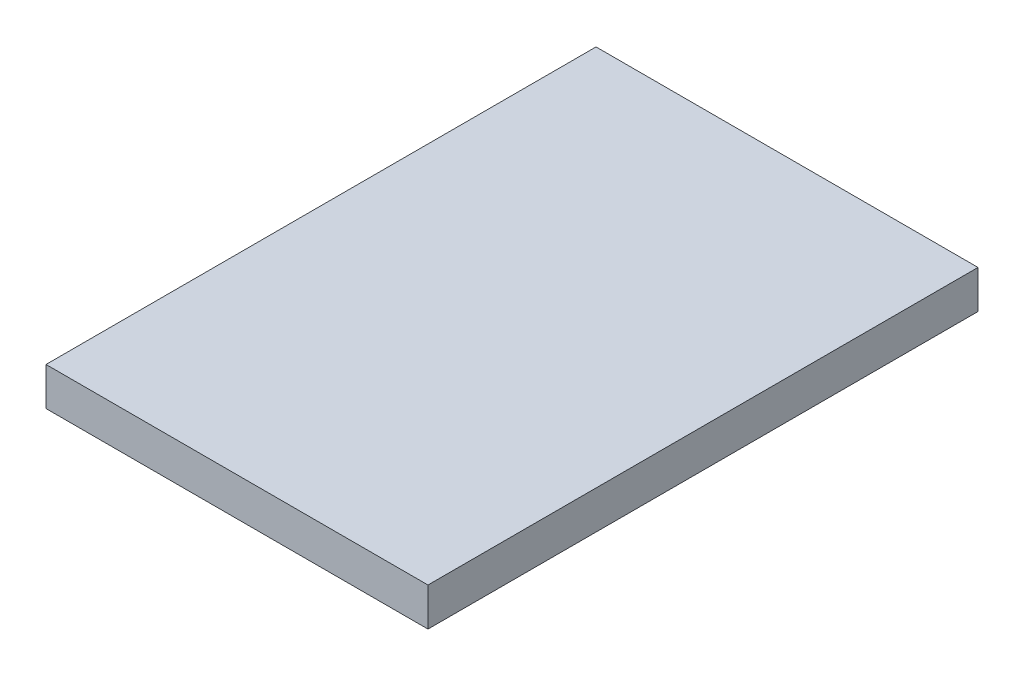
ISO-10303-21;
HEADER;
FILE_DESCRIPTION(('STEP AP214'),'2;1');
FILE_NAME('part.step','',(''),(''),'','','');
FILE_SCHEMA(('AUTOMOTIVE_DESIGN { 1 0 10303 214 1 1 1 1 }'));
ENDSEC;
DATA;
#1=APPLICATION_CONTEXT('core data for automotive mechanical design processes');
#2=APPLICATION_PROTOCOL_DEFINITION('international standard','automotive_design',2000,#1);
#3=PRODUCT_CONTEXT('',#1,'mechanical');
#4=PRODUCT('Part','Part','',(#3));
#5=PRODUCT_RELATED_PRODUCT_CATEGORY('part','',(#4));
#6=PRODUCT_DEFINITION_FORMATION('','',#4);
#7=PRODUCT_DEFINITION_CONTEXT('part definition',#1,'design');
#8=PRODUCT_DEFINITION('design','',#6,#7);
#9=PRODUCT_DEFINITION_SHAPE('','',#8);
#10=(LENGTH_UNIT() NAMED_UNIT(*) SI_UNIT(.MILLI.,.METRE.));
#11=(NAMED_UNIT(*) PLANE_ANGLE_UNIT() SI_UNIT($,.RADIAN.));
#12=(NAMED_UNIT(*) SI_UNIT($,.STERADIAN.) SOLID_ANGLE_UNIT());
#13=UNCERTAINTY_MEASURE_WITH_UNIT(LENGTH_MEASURE(1.E-05),#10,'distance_accuracy_value','');
#14=(GEOMETRIC_REPRESENTATION_CONTEXT(3) GLOBAL_UNCERTAINTY_ASSIGNED_CONTEXT((#13)) GLOBAL_UNIT_ASSIGNED_CONTEXT((#10,
#11,#12)) REPRESENTATION_CONTEXT('',''));
#15=CARTESIAN_POINT('',(0.,0.,0.));
#16=DIRECTION('',(0.,0.,1.));
#17=DIRECTION('',(1.,0.,0.));
#18=AXIS2_PLACEMENT_3D('',#15,#16,#17);
#19=CARTESIAN_POINT('',(12.5,2.5,18.));
#20=DIRECTION('',(-1.,0.,0.));
#21=DIRECTION('',(0.,0.,1.));
#22=AXIS2_PLACEMENT_3D('',#19,#20,#21);
#23=PLANE('',#22);
#24=DIRECTION('',(0.,0.,-1.));
#25=VECTOR('',#24,1.);
#26=CARTESIAN_POINT('',(12.5,0.,18.));
#27=LINE('',#26,#25);
#28=CARTESIAN_POINT('',(12.5,0.,18.));
#29=VERTEX_POINT('',#28);
#30=CARTESIAN_POINT('',(12.5,0.,-18.));
#31=VERTEX_POINT('',#30);
#32=EDGE_CURVE('E96',#29,#31,#27,.T.);
#33=ORIENTED_EDGE('',*,*,#32,.T.);
#34=DIRECTION('',(0.,-1.,0.));
#35=VECTOR('',#34,1.);
#36=CARTESIAN_POINT('',(12.5,2.5,-18.));
#37=LINE('',#36,#35);
#38=CARTESIAN_POINT('',(12.5,2.5,-18.));
#39=VERTEX_POINT('',#38);
#40=EDGE_CURVE('E11',#39,#31,#37,.T.);
#41=ORIENTED_EDGE('',*,*,#40,.F.);
#42=DIRECTION('',(0.,0.,-1.));
#43=VECTOR('',#42,1.);
#44=CARTESIAN_POINT('',(12.5,2.5,18.));
#45=LINE('',#44,#43);
#46=CARTESIAN_POINT('',(12.5,2.5,18.));
#47=VERTEX_POINT('',#46);
#48=EDGE_CURVE('E84',#47,#39,#45,.T.);
#49=ORIENTED_EDGE('',*,*,#48,.F.);
#50=DIRECTION('',(0.,-1.,0.));
#51=VECTOR('',#50,1.);
#52=CARTESIAN_POINT('',(12.5,2.5,18.));
#53=LINE('',#52,#51);
#54=EDGE_CURVE('E92',#47,#29,#53,.T.);
#55=ORIENTED_EDGE('',*,*,#54,.T.);
#56=EDGE_LOOP('',(#33,#41,#49,#55));
#57=FACE_BOUND('',#56,.T.);
#58=ADVANCED_FACE('F33',(#57),#23,.F.);
#59=CARTESIAN_POINT('',(-12.5,2.5,-18.));
#60=DIRECTION('',(0.,0.,1.));
#61=DIRECTION('',(1.,0.,0.));
#62=AXIS2_PLACEMENT_3D('',#59,#60,#61);
#63=PLANE('',#62);
#64=DIRECTION('',(-1.,0.,0.));
#65=VECTOR('',#64,1.);
#66=CARTESIAN_POINT('',(-12.5,0.,-18.));
#67=LINE('',#66,#65);
#68=CARTESIAN_POINT('',(-12.5,0.,-18.));
#69=VERTEX_POINT('',#68);
#70=EDGE_CURVE('E88',#31,#69,#67,.T.);
#71=ORIENTED_EDGE('',*,*,#70,.T.);
#72=DIRECTION('',(0.,-1.,0.));
#73=VECTOR('',#72,1.);
#74=CARTESIAN_POINT('',(-12.5,2.5,-18.));
#75=LINE('',#74,#73);
#76=CARTESIAN_POINT('',(-12.5,2.5,-18.));
#77=VERTEX_POINT('',#76);
#78=EDGE_CURVE('E41',#77,#69,#75,.T.);
#79=ORIENTED_EDGE('',*,*,#78,.F.);
#80=DIRECTION('',(-1.,0.,0.));
#81=VECTOR('',#80,1.);
#82=CARTESIAN_POINT('',(-12.5,2.5,-18.));
#83=LINE('',#82,#81);
#84=EDGE_CURVE('E79',#39,#77,#83,.T.);
#85=ORIENTED_EDGE('',*,*,#84,.F.);
#86=ORIENTED_EDGE('',*,*,#40,.T.);
#87=EDGE_LOOP('',(#71,#79,#85,#86));
#88=FACE_BOUND('',#87,.T.);
#89=ADVANCED_FACE('F87',(#88),#63,.F.);
#90=CARTESIAN_POINT('',(-12.5,2.5,18.));
#91=DIRECTION('',(1.,0.,0.));
#92=DIRECTION('',(0.,0.,-1.));
#93=AXIS2_PLACEMENT_3D('',#90,#91,#92);
#94=PLANE('',#93);
#95=DIRECTION('',(0.,0.,1.));
#96=VECTOR('',#95,1.);
#97=CARTESIAN_POINT('',(-12.5,0.,18.));
#98=LINE('',#97,#96);
#99=CARTESIAN_POINT('',(-12.5,0.,18.));
#100=VERTEX_POINT('',#99);
#101=EDGE_CURVE('E66',#69,#100,#98,.T.);
#102=ORIENTED_EDGE('',*,*,#101,.T.);
#103=DIRECTION('',(0.,-1.,0.));
#104=VECTOR('',#103,1.);
#105=CARTESIAN_POINT('',(-12.5,2.5,18.));
#106=LINE('',#105,#104);
#107=CARTESIAN_POINT('',(-12.5,2.5,18.));
#108=VERTEX_POINT('',#107);
#109=EDGE_CURVE('E89',#108,#100,#106,.T.);
#110=ORIENTED_EDGE('',*,*,#109,.F.);
#111=DIRECTION('',(0.,0.,1.));
#112=VECTOR('',#111,1.);
#113=CARTESIAN_POINT('',(-12.5,2.5,18.));
#114=LINE('',#113,#112);
#115=EDGE_CURVE('E82',#77,#108,#114,.T.);
#116=ORIENTED_EDGE('',*,*,#115,.F.);
#117=ORIENTED_EDGE('',*,*,#78,.T.);
#118=EDGE_LOOP('',(#102,#110,#116,#117));
#119=FACE_BOUND('',#118,.T.);
#120=ADVANCED_FACE('F90',(#119),#94,.F.);
#121=CARTESIAN_POINT('',(-12.5,2.5,18.));
#122=DIRECTION('',(0.,0.,-1.));
#123=DIRECTION('',(-1.,0.,0.));
#124=AXIS2_PLACEMENT_3D('',#121,#122,#123);
#125=PLANE('',#124);
#126=DIRECTION('',(1.,0.,0.));
#127=VECTOR('',#126,1.);
#128=CARTESIAN_POINT('',(-12.5,0.,18.));
#129=LINE('',#128,#127);
#130=EDGE_CURVE('E72',#100,#29,#129,.T.);
#131=ORIENTED_EDGE('',*,*,#130,.T.);
#132=ORIENTED_EDGE('',*,*,#54,.F.);
#133=DIRECTION('',(1.,0.,0.));
#134=VECTOR('',#133,1.);
#135=CARTESIAN_POINT('',(-12.5,2.5,18.));
#136=LINE('',#135,#134);
#137=EDGE_CURVE('E49',#108,#47,#136,.T.);
#138=ORIENTED_EDGE('',*,*,#137,.F.);
#139=ORIENTED_EDGE('',*,*,#109,.T.);
#140=EDGE_LOOP('',(#131,#132,#138,#139));
#141=FACE_BOUND('',#140,.T.);
#142=ADVANCED_FACE('F103',(#141),#125,.F.);
#143=CARTESIAN_POINT('',(0.,2.5,0.));
#144=DIRECTION('',(0.,-1.,0.));
#145=DIRECTION('',(0.,0.,-1.));
#146=AXIS2_PLACEMENT_3D('',#143,#144,#145);
#147=PLANE('',#146);
#148=ORIENTED_EDGE('',*,*,#48,.T.);
#149=ORIENTED_EDGE('',*,*,#84,.T.);
#150=ORIENTED_EDGE('',*,*,#115,.T.);
#151=ORIENTED_EDGE('',*,*,#137,.T.);
#152=EDGE_LOOP('',(#148,#149,#150,#151));
#153=FACE_BOUND('',#152,.T.);
#154=ADVANCED_FACE('F80',(#153),#147,.F.);
#155=CARTESIAN_POINT('',(0.,0.,0.));
#156=DIRECTION('',(0.,-1.,0.));
#157=DIRECTION('',(0.,0.,-1.));
#158=AXIS2_PLACEMENT_3D('',#155,#156,#157);
#159=PLANE('',#158);
#160=ORIENTED_EDGE('',*,*,#32,.F.);
#161=ORIENTED_EDGE('',*,*,#130,.F.);
#162=ORIENTED_EDGE('',*,*,#101,.F.);
#163=ORIENTED_EDGE('',*,*,#70,.F.);
#164=EDGE_LOOP('',(#160,#161,#162,#163));
#165=FACE_BOUND('',#164,.T.);
#166=ADVANCED_FACE('F106',(#165),#159,.T.);
#167=CLOSED_SHELL('',(#58,#89,#120,#142,#154,#166));
#168=MANIFOLD_SOLID_BREP('B2',#167);
#169=ADVANCED_BREP_SHAPE_REPRESENTATION('',(#18,#168),#14);
#170=SHAPE_DEFINITION_REPRESENTATION(#9,#169);
ENDSEC;
END-ISO-10303-21;
